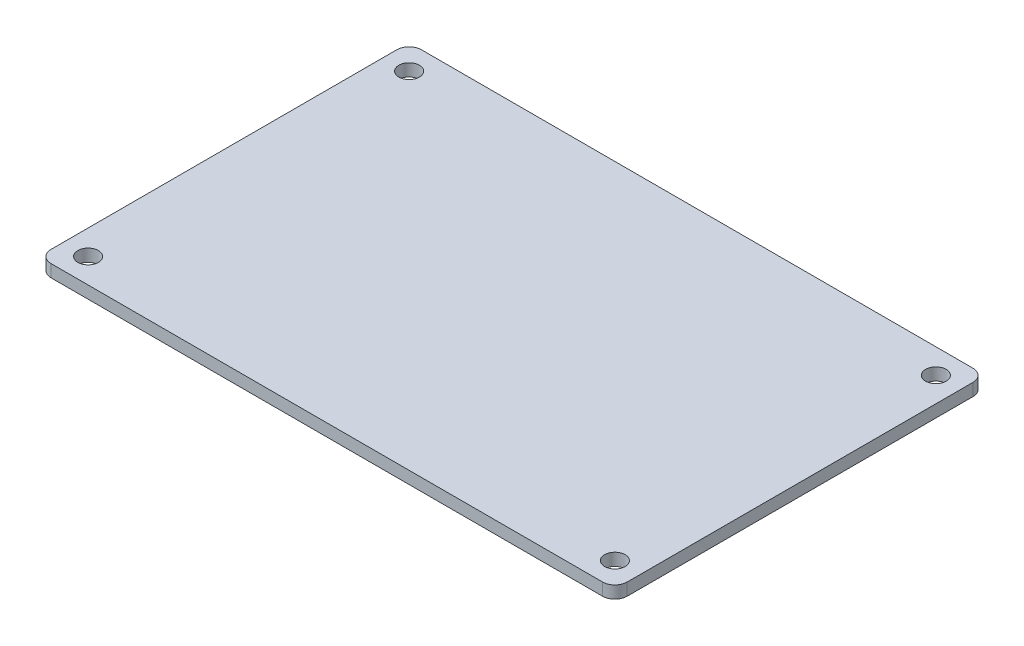
ISO-10303-21;
HEADER;
FILE_DESCRIPTION(('STEP AP214'),'2;1');
FILE_NAME('part.step','',(''),(''),'','','');
FILE_SCHEMA(('AUTOMOTIVE_DESIGN { 1 0 10303 214 1 1 1 1 }'));
ENDSEC;
DATA;
#1=APPLICATION_CONTEXT('core data for automotive mechanical design processes');
#2=APPLICATION_PROTOCOL_DEFINITION('international standard','automotive_design',2000,#1);
#3=PRODUCT_CONTEXT('',#1,'mechanical');
#4=PRODUCT('Part','Part','',(#3));
#5=PRODUCT_RELATED_PRODUCT_CATEGORY('part','',(#4));
#6=PRODUCT_DEFINITION_FORMATION('','',#4);
#7=PRODUCT_DEFINITION_CONTEXT('part definition',#1,'design');
#8=PRODUCT_DEFINITION('design','',#6,#7);
#9=PRODUCT_DEFINITION_SHAPE('','',#8);
#10=(LENGTH_UNIT() NAMED_UNIT(*) SI_UNIT(.MILLI.,.METRE.));
#11=(NAMED_UNIT(*) PLANE_ANGLE_UNIT() SI_UNIT($,.RADIAN.));
#12=(NAMED_UNIT(*) SI_UNIT($,.STERADIAN.) SOLID_ANGLE_UNIT());
#13=UNCERTAINTY_MEASURE_WITH_UNIT(LENGTH_MEASURE(1.E-05),#10,'distance_accuracy_value','');
#14=(GEOMETRIC_REPRESENTATION_CONTEXT(3) GLOBAL_UNCERTAINTY_ASSIGNED_CONTEXT((#13)) GLOBAL_UNIT_ASSIGNED_CONTEXT((#10,
#11,#12)) REPRESENTATION_CONTEXT('',''));
#15=CARTESIAN_POINT('',(0.,0.,0.));
#16=DIRECTION('',(0.,0.,1.));
#17=DIRECTION('',(1.,0.,0.));
#18=AXIS2_PLACEMENT_3D('',#15,#16,#17);
#19=CARTESIAN_POINT('',(-34.9250000289875,-9.,-23.7282204610565));
#20=DIRECTION('',(0.,1.,0.));
#21=DIRECTION('',(0.,0.,1.));
#22=AXIS2_PLACEMENT_3D('',#19,#20,#21);
#23=CYLINDRICAL_SURFACE('',#22,6.);
#24=CARTESIAN_POINT('',(-34.9250000289875,-3.,-23.7282204610565));
#25=DIRECTION('',(0.,-1.,0.));
#26=DIRECTION('',(0.,0.,-1.));
#27=AXIS2_PLACEMENT_3D('',#24,#25,#26);
#28=CIRCLE('',#27,6.);
#29=CARTESIAN_POINT('',(-34.9250000289875,-3.,-29.7282204610565));
#30=VERTEX_POINT('',#29);
#31=EDGE_CURVE('E167',#30,#30,#28,.F.);
#32=ORIENTED_EDGE('',*,*,#31,.F.);
#33=EDGE_LOOP('',(#32));
#34=FACE_BOUND('',#33,.T.);
#35=CARTESIAN_POINT('',(-34.9250000289875,-9.,-23.7282204610565));
#36=DIRECTION('',(0.,1.,0.));
#37=DIRECTION('',(0.,0.,1.));
#38=AXIS2_PLACEMENT_3D('',#35,#36,#37);
#39=CIRCLE('',#38,6.);
#40=CARTESIAN_POINT('',(-34.9250000289875,-9.,-17.7282204610565));
#41=VERTEX_POINT('',#40);
#42=EDGE_CURVE('E171',#41,#41,#39,.T.);
#43=ORIENTED_EDGE('',*,*,#42,.T.);
#44=EDGE_LOOP('',(#43));
#45=FACE_BOUND('',#44,.T.);
#46=ADVANCED_FACE('F34',(#34,#45),#23,.T.);
#47=CARTESIAN_POINT('',(-34.9250000289875,-9.,-23.7282204610565));
#48=DIRECTION('',(0.,1.,0.));
#49=DIRECTION('',(0.,0.,1.));
#50=AXIS2_PLACEMENT_3D('',#47,#48,#49);
#51=PLANE('',#50);
#52=CARTESIAN_POINT('',(-34.9250000289875,-9.,-23.7282204610565));
#53=DIRECTION('',(0.,1.,0.));
#54=DIRECTION('',(0.,0.,1.));
#55=AXIS2_PLACEMENT_3D('',#52,#53,#54);
#56=CIRCLE('',#55,3.);
#57=CARTESIAN_POINT('',(-34.9250000289875,-9.,-20.7282204610565));
#58=VERTEX_POINT('',#57);
#59=EDGE_CURVE('E172',#58,#58,#56,.T.);
#60=ORIENTED_EDGE('',*,*,#59,.T.);
#61=EDGE_LOOP('',(#60));
#62=FACE_BOUND('',#61,.T.);
#63=ORIENTED_EDGE('',*,*,#42,.F.);
#64=EDGE_LOOP('',(#63));
#65=FACE_BOUND('',#64,.T.);
#66=ADVANCED_FACE('F178',(#62,#65),#51,.F.);
#67=CARTESIAN_POINT('',(-34.9250000289875,-9.,-23.7282204610565));
#68=DIRECTION('',(0.,1.,0.));
#69=DIRECTION('',(0.,0.,1.));
#70=AXIS2_PLACEMENT_3D('',#67,#68,#69);
#71=CYLINDRICAL_SURFACE('',#70,3.);
#72=CARTESIAN_POINT('',(-34.9250000289875,-3.,-23.7282204610565));
#73=DIRECTION('',(0.,-1.,0.));
#74=DIRECTION('',(0.,0.,-1.));
#75=AXIS2_PLACEMENT_3D('',#72,#73,#74);
#76=CIRCLE('',#75,3.);
#77=CARTESIAN_POINT('',(-34.9250000289875,-3.,-26.7282204610565));
#78=VERTEX_POINT('',#77);
#79=EDGE_CURVE('E134',#78,#78,#76,.F.);
#80=ORIENTED_EDGE('',*,*,#79,.T.);
#81=EDGE_LOOP('',(#80));
#82=FACE_BOUND('',#81,.T.);
#83=ORIENTED_EDGE('',*,*,#59,.F.);
#84=EDGE_LOOP('',(#83));
#85=FACE_BOUND('',#84,.T.);
#86=ADVANCED_FACE('F180',(#82,#85),#71,.F.);
#87=CARTESIAN_POINT('',(0.,-3.,0.));
#88=DIRECTION('',(0.,-1.,0.));
#89=DIRECTION('',(0.,0.,-1.));
#90=AXIS2_PLACEMENT_3D('',#87,#88,#89);
#91=PLANE('',#90);
#92=ORIENTED_EDGE('',*,*,#79,.F.);
#93=EDGE_LOOP('',(#92));
#94=FACE_BOUND('',#93,.T.);
#95=ADVANCED_FACE('F187',(#94),#91,.T.);
#96=CARTESIAN_POINT('',(69.725915747739,-3.,-44.2183613735949));
#97=DIRECTION('',(1.,0.,0.));
#98=DIRECTION('',(0.,0.,-1.));
#99=AXIS2_PLACEMENT_3D('',#96,#97,#98);
#100=PLANE('',#99);
#101=DIRECTION('',(0.,0.,-1.));
#102=VECTOR('',#101,1.);
#103=CARTESIAN_POINT('',(69.725915747739,-3.,-44.2183613735949));
#104=LINE('',#103,#102);
#105=CARTESIAN_POINT('',(69.7259157477385,-3.,42.7816386264051));
#106=VERTEX_POINT('',#105);
#107=CARTESIAN_POINT('',(69.725915747739,-3.,-41.2183613735949));
#108=VERTEX_POINT('',#107);
#109=EDGE_CURVE('E163',#106,#108,#104,.T.);
#110=ORIENTED_EDGE('',*,*,#109,.T.);
#111=DIRECTION('',(0.,1.,0.));
#112=VECTOR('',#111,1.);
#113=CARTESIAN_POINT('',(69.725915747739,-3.,-41.2183613735949));
#114=LINE('',#113,#112);
#115=CARTESIAN_POINT('',(69.725915747739,0.,-41.2183613735949));
#116=VERTEX_POINT('',#115);
#117=EDGE_CURVE('E119',#108,#116,#114,.T.);
#118=ORIENTED_EDGE('',*,*,#117,.T.);
#119=DIRECTION('',(0.,0.,-1.));
#120=VECTOR('',#119,1.);
#121=CARTESIAN_POINT('',(69.725915747739,0.,-44.2183613735949));
#122=LINE('',#121,#120);
#123=CARTESIAN_POINT('',(69.7259157477384,0.,42.7816386264051));
#124=VERTEX_POINT('',#123);
#125=EDGE_CURVE('E102',#124,#116,#122,.T.);
#126=ORIENTED_EDGE('',*,*,#125,.F.);
#127=DIRECTION('',(0.,1.,0.));
#128=VECTOR('',#127,1.);
#129=CARTESIAN_POINT('',(69.7259157477385,-3.,42.7816386264051));
#130=LINE('',#129,#128);
#131=EDGE_CURVE('E116',#124,#106,#130,.F.);
#132=ORIENTED_EDGE('',*,*,#131,.T.);
#133=EDGE_LOOP('',(#110,#118,#126,#132));
#134=FACE_BOUND('',#133,.T.);
#135=ADVANCED_FACE('F115',(#134),#100,.T.);
#136=CARTESIAN_POINT('',(69.7259157477385,-3.,45.7816386264051));
#137=DIRECTION('',(0.,0.,1.));
#138=DIRECTION('',(1.,0.,0.));
#139=AXIS2_PLACEMENT_3D('',#136,#137,#138);
#140=PLANE('',#139);
#141=DIRECTION('',(1.,0.,0.));
#142=VECTOR('',#141,1.);
#143=CARTESIAN_POINT('',(69.7259157477385,-3.,45.7816386264051));
#144=LINE('',#143,#142);
#145=CARTESIAN_POINT('',(-67.2740842522615,-3.,45.7816386264051));
#146=VERTEX_POINT('',#145);
#147=CARTESIAN_POINT('',(66.7259157477385,-3.,45.7816386264051));
#148=VERTEX_POINT('',#147);
#149=EDGE_CURVE('E223',#146,#148,#144,.T.);
#150=ORIENTED_EDGE('',*,*,#149,.T.);
#151=DIRECTION('',(0.,1.,0.));
#152=VECTOR('',#151,1.);
#153=CARTESIAN_POINT('',(66.7259157477385,-3.,45.7816386264051));
#154=LINE('',#153,#152);
#155=CARTESIAN_POINT('',(66.7259157477385,0.,45.7816386264051));
#156=VERTEX_POINT('',#155);
#157=EDGE_CURVE('E153',#148,#156,#154,.T.);
#158=ORIENTED_EDGE('',*,*,#157,.T.);
#159=DIRECTION('',(1.,0.,0.));
#160=VECTOR('',#159,1.);
#161=CARTESIAN_POINT('',(69.7259157477385,0.,45.7816386264051));
#162=LINE('',#161,#160);
#163=CARTESIAN_POINT('',(-67.2740842522615,0.,45.7816386264051));
#164=VERTEX_POINT('',#163);
#165=EDGE_CURVE('E104',#164,#156,#162,.T.);
#166=ORIENTED_EDGE('',*,*,#165,.F.);
#167=DIRECTION('',(0.,1.,0.));
#168=VECTOR('',#167,1.);
#169=CARTESIAN_POINT('',(-67.2740842522615,-3.,45.7816386264051));
#170=LINE('',#169,#168);
#171=EDGE_CURVE('E151',#164,#146,#170,.F.);
#172=ORIENTED_EDGE('',*,*,#171,.T.);
#173=EDGE_LOOP('',(#150,#158,#166,#172));
#174=FACE_BOUND('',#173,.T.);
#175=ADVANCED_FACE('F240',(#174),#140,.T.);
#176=CARTESIAN_POINT('',(-70.2740842522615,-3.,-44.2183613735949));
#177=DIRECTION('',(-1.,0.,0.));
#178=DIRECTION('',(0.,0.,1.));
#179=AXIS2_PLACEMENT_3D('',#176,#177,#178);
#180=PLANE('',#179);
#181=DIRECTION('',(0.,0.,1.));
#182=VECTOR('',#181,1.);
#183=CARTESIAN_POINT('',(-70.2740842522615,0.,-44.2183613735949));
#184=LINE('',#183,#182);
#185=CARTESIAN_POINT('',(-70.2740842522616,0.,-41.2183613735949));
#186=VERTEX_POINT('',#185);
#187=CARTESIAN_POINT('',(-70.2740842522616,0.,42.7816386264051));
#188=VERTEX_POINT('',#187);
#189=EDGE_CURVE('E158',#186,#188,#184,.T.);
#190=ORIENTED_EDGE('',*,*,#189,.F.);
#191=DIRECTION('',(0.,1.,0.));
#192=VECTOR('',#191,1.);
#193=CARTESIAN_POINT('',(-70.2740842522616,-3.,-41.2183613735949));
#194=LINE('',#193,#192);
#195=CARTESIAN_POINT('',(-70.2740842522616,-3.,-41.2183613735949));
#196=VERTEX_POINT('',#195);
#197=EDGE_CURVE('E11',#186,#196,#194,.F.);
#198=ORIENTED_EDGE('',*,*,#197,.T.);
#199=DIRECTION('',(0.,0.,1.));
#200=VECTOR('',#199,1.);
#201=CARTESIAN_POINT('',(-70.2740842522615,-3.,-44.2183613735949));
#202=LINE('',#201,#200);
#203=CARTESIAN_POINT('',(-70.2740842522616,-3.,42.7816386264051));
#204=VERTEX_POINT('',#203);
#205=EDGE_CURVE('E159',#196,#204,#202,.T.);
#206=ORIENTED_EDGE('',*,*,#205,.T.);
#207=DIRECTION('',(0.,1.,0.));
#208=VECTOR('',#207,1.);
#209=CARTESIAN_POINT('',(-70.2740842522616,-3.,42.7816386264051));
#210=LINE('',#209,#208);
#211=EDGE_CURVE('E42',#204,#188,#210,.T.);
#212=ORIENTED_EDGE('',*,*,#211,.T.);
#213=EDGE_LOOP('',(#190,#198,#206,#212));
#214=FACE_BOUND('',#213,.T.);
#215=ADVANCED_FACE('F157',(#214),#180,.T.);
#216=CARTESIAN_POINT('',(69.725915747739,-3.,-44.2183613735949));
#217=DIRECTION('',(0.,0.,-1.));
#218=DIRECTION('',(-1.,0.,0.));
#219=AXIS2_PLACEMENT_3D('',#216,#217,#218);
#220=PLANE('',#219);
#221=DIRECTION('',(-1.,0.,0.));
#222=VECTOR('',#221,1.);
#223=CARTESIAN_POINT('',(69.725915747739,0.,-44.2183613735949));
#224=LINE('',#223,#222);
#225=CARTESIAN_POINT('',(66.725915747739,0.,-44.2183613735949));
#226=VERTEX_POINT('',#225);
#227=CARTESIAN_POINT('',(-67.2740842522615,0.,-44.2183613735949));
#228=VERTEX_POINT('',#227);
#229=EDGE_CURVE('E120',#226,#228,#224,.T.);
#230=ORIENTED_EDGE('',*,*,#229,.F.);
#231=DIRECTION('',(0.,1.,0.));
#232=VECTOR('',#231,1.);
#233=CARTESIAN_POINT('',(66.725915747739,-3.,-44.2183613735949));
#234=LINE('',#233,#232);
#235=CARTESIAN_POINT('',(66.725915747739,-3.,-44.2183613735949));
#236=VERTEX_POINT('',#235);
#237=EDGE_CURVE('E143',#226,#236,#234,.F.);
#238=ORIENTED_EDGE('',*,*,#237,.T.);
#239=DIRECTION('',(-1.,0.,0.));
#240=VECTOR('',#239,1.);
#241=CARTESIAN_POINT('',(69.725915747739,-3.,-44.2183613735949));
#242=LINE('',#241,#240);
#243=CARTESIAN_POINT('',(-67.2740842522615,-3.,-44.2183613735949));
#244=VERTEX_POINT('',#243);
#245=EDGE_CURVE('E216',#236,#244,#242,.T.);
#246=ORIENTED_EDGE('',*,*,#245,.T.);
#247=DIRECTION('',(0.,1.,0.));
#248=VECTOR('',#247,1.);
#249=CARTESIAN_POINT('',(-67.2740842522615,-3.,-44.2183613735949));
#250=LINE('',#249,#248);
#251=EDGE_CURVE('E140',#244,#228,#250,.T.);
#252=ORIENTED_EDGE('',*,*,#251,.T.);
#253=EDGE_LOOP('',(#230,#238,#246,#252));
#254=FACE_BOUND('',#253,.T.);
#255=ADVANCED_FACE('F220',(#254),#220,.T.);
#256=CARTESIAN_POINT('',(-41.2750000339225,-3.,24.5317795317435));
#257=DIRECTION('',(0.,-1.,0.));
#258=DIRECTION('',(0.,0.,-1.));
#259=AXIS2_PLACEMENT_3D('',#256,#257,#258);
#260=CIRCLE('',#259,6.00000000000001);
#261=CARTESIAN_POINT('',(-41.2750000339225,-3.,18.5317795317435));
#262=VERTEX_POINT('',#261);
#263=EDGE_CURVE('E126',#262,#262,#260,.T.);
#264=ORIENTED_EDGE('',*,*,#263,.F.);
#265=EDGE_LOOP('',(#264));
#266=FACE_BOUND('',#265,.T.);
#267=CARTESIAN_POINT('',(41.2750000339225,-3.,24.5317794796835));
#268=DIRECTION('',(0.,-1.,0.));
#269=DIRECTION('',(0.,0.,-1.));
#270=AXIS2_PLACEMENT_3D('',#267,#268,#269);
#271=CIRCLE('',#270,6.);
#272=CARTESIAN_POINT('',(41.2750000339225,-3.,18.5317794796835));
#273=VERTEX_POINT('',#272);
#274=EDGE_CURVE('E131',#273,#273,#271,.T.);
#275=ORIENTED_EDGE('',*,*,#274,.F.);
#276=EDGE_LOOP('',(#275));
#277=FACE_BOUND('',#276,.T.);
#278=CARTESIAN_POINT('',(40.0049999842425,-3.,-23.7282204529105));
#279=DIRECTION('',(0.,-1.,0.));
#280=DIRECTION('',(0.,0.,-1.));
#281=AXIS2_PLACEMENT_3D('',#278,#279,#280);
#282=CIRCLE('',#281,6.00000000000001);
#283=CARTESIAN_POINT('',(40.0049999842425,-3.,-29.7282204529105));
#284=VERTEX_POINT('',#283);
#285=EDGE_CURVE('E170',#284,#284,#282,.T.);
#286=ORIENTED_EDGE('',*,*,#285,.F.);
#287=EDGE_LOOP('',(#286));
#288=FACE_BOUND('',#287,.T.);
#289=ORIENTED_EDGE('',*,*,#31,.T.);
#290=EDGE_LOOP('',(#289));
#291=FACE_BOUND('',#290,.T.);
#292=CARTESIAN_POINT('',(-64.2740842522615,-3.,39.7816386264051));
#293=DIRECTION('',(0.,1.,0.));
#294=DIRECTION('',(0.,0.,-1.));
#295=AXIS2_PLACEMENT_3D('',#292,#293,#294);
#296=CIRCLE('',#295,2.49999999999141);
#297=CARTESIAN_POINT('',(-64.2740842522615,-3.,37.2816386264137));
#298=VERTEX_POINT('',#297);
#299=EDGE_CURVE('E315',#298,#298,#296,.T.);
#300=ORIENTED_EDGE('',*,*,#299,.T.);
#301=EDGE_LOOP('',(#300));
#302=FACE_BOUND('',#301,.T.);
#303=CARTESIAN_POINT('',(63.7259157477384,-3.,39.7816386264051));
#304=DIRECTION('',(0.,1.,0.));
#305=DIRECTION('',(0.,0.,1.));
#306=AXIS2_PLACEMENT_3D('',#303,#304,#305);
#307=CIRCLE('',#306,2.49999999999142);
#308=CARTESIAN_POINT('',(63.7259157477384,-3.,42.2816386263965));
#309=VERTEX_POINT('',#308);
#310=EDGE_CURVE('E321',#309,#309,#307,.T.);
#311=ORIENTED_EDGE('',*,*,#310,.T.);
#312=EDGE_LOOP('',(#311));
#313=FACE_BOUND('',#312,.T.);
#314=CARTESIAN_POINT('',(63.7259157477385,-3.,-38.2183613735949));
#315=DIRECTION('',(0.,1.,0.));
#316=DIRECTION('',(0.,0.,-1.));
#317=AXIS2_PLACEMENT_3D('',#314,#315,#316);
#318=CIRCLE('',#317,2.50000000000535);
#319=CARTESIAN_POINT('',(63.7259157477385,-3.,-40.7183613736002));
#320=VERTEX_POINT('',#319);
#321=EDGE_CURVE('E327',#320,#320,#318,.T.);
#322=ORIENTED_EDGE('',*,*,#321,.T.);
#323=EDGE_LOOP('',(#322));
#324=FACE_BOUND('',#323,.T.);
#325=CARTESIAN_POINT('',(-64.2740842522615,-3.,-38.2183613735949));
#326=DIRECTION('',(0.,1.,0.));
#327=DIRECTION('',(0.,0.,1.));
#328=AXIS2_PLACEMENT_3D('',#325,#326,#327);
#329=CIRCLE('',#328,2.49999999997806);
#330=CARTESIAN_POINT('',(-64.2740842522615,-3.,-35.7183613736168));
#331=VERTEX_POINT('',#330);
#332=EDGE_CURVE('E121',#331,#331,#329,.T.);
#333=ORIENTED_EDGE('',*,*,#332,.T.);
#334=EDGE_LOOP('',(#333));
#335=FACE_BOUND('',#334,.T.);
#336=ORIENTED_EDGE('',*,*,#245,.F.);
#337=CARTESIAN_POINT('',(66.725915747739,-3.,-41.2183613735949));
#338=DIRECTION('',(0.,-1.,0.));
#339=DIRECTION('',(0.,0.,-1.));
#340=AXIS2_PLACEMENT_3D('',#337,#338,#339);
#341=CIRCLE('',#340,3.);
#342=EDGE_CURVE('E149',#236,#108,#341,.T.);
#343=ORIENTED_EDGE('',*,*,#342,.T.);
#344=ORIENTED_EDGE('',*,*,#109,.F.);
#345=CARTESIAN_POINT('',(66.7259157477385,-3.,42.7816386264051));
#346=DIRECTION('',(0.,-1.,0.));
#347=DIRECTION('',(0.,0.,-1.));
#348=AXIS2_PLACEMENT_3D('',#345,#346,#347);
#349=CIRCLE('',#348,3.);
#350=EDGE_CURVE('E125',#106,#148,#349,.T.);
#351=ORIENTED_EDGE('',*,*,#350,.T.);
#352=ORIENTED_EDGE('',*,*,#149,.F.);
#353=CARTESIAN_POINT('',(-67.2740842522616,-3.,42.7816386264051));
#354=DIRECTION('',(0.,-1.,0.));
#355=DIRECTION('',(0.,0.,-1.));
#356=AXIS2_PLACEMENT_3D('',#353,#354,#355);
#357=CIRCLE('',#356,3.);
#358=EDGE_CURVE('E49',#146,#204,#357,.T.);
#359=ORIENTED_EDGE('',*,*,#358,.T.);
#360=ORIENTED_EDGE('',*,*,#205,.F.);
#361=CARTESIAN_POINT('',(-67.2740842522616,-3.,-41.2183613735949));
#362=DIRECTION('',(0.,-1.,0.));
#363=DIRECTION('',(0.,0.,-1.));
#364=AXIS2_PLACEMENT_3D('',#361,#362,#363);
#365=CIRCLE('',#364,3.);
#366=EDGE_CURVE('E146',#196,#244,#365,.T.);
#367=ORIENTED_EDGE('',*,*,#366,.T.);
#368=EDGE_LOOP('',(#336,#343,#344,#351,#352,#359,#360,#367));
#369=FACE_BOUND('',#368,.T.);
#370=ADVANCED_FACE('F215',(#266,#277,#288,#291,#302,#313,#324,#335,#369),#91,.T.);
#371=CARTESIAN_POINT('',(-64.2740842522615,-3.,-38.2183613735949));
#372=DIRECTION('',(0.,1.,0.));
#373=DIRECTION('',(0.,0.,1.));
#374=AXIS2_PLACEMENT_3D('',#371,#372,#373);
#375=CYLINDRICAL_SURFACE('',#374,2.49999999997806);
#376=ORIENTED_EDGE('',*,*,#332,.F.);
#377=EDGE_LOOP('',(#376));
#378=FACE_BOUND('',#377,.T.);
#379=CARTESIAN_POINT('',(-64.2740842522615,0.,-38.2183613735949));
#380=DIRECTION('',(0.,1.,0.));
#381=DIRECTION('',(0.,0.,1.));
#382=AXIS2_PLACEMENT_3D('',#379,#380,#381);
#383=CIRCLE('',#382,2.49999999997806);
#384=CARTESIAN_POINT('',(-64.2740842522615,0.,-35.7183613736168));
#385=VERTEX_POINT('',#384);
#386=EDGE_CURVE('E330',#385,#385,#383,.T.);
#387=ORIENTED_EDGE('',*,*,#386,.T.);
#388=EDGE_LOOP('',(#387));
#389=FACE_BOUND('',#388,.T.);
#390=ADVANCED_FACE('F244',(#378,#389),#375,.F.);
#391=CARTESIAN_POINT('',(63.7259157477385,-3.,-38.2183613735949));
#392=DIRECTION('',(0.,1.,0.));
#393=DIRECTION('',(0.,0.,1.));
#394=AXIS2_PLACEMENT_3D('',#391,#392,#393);
#395=CYLINDRICAL_SURFACE('',#394,2.50000000000535);
#396=ORIENTED_EDGE('',*,*,#321,.F.);
#397=EDGE_LOOP('',(#396));
#398=FACE_BOUND('',#397,.T.);
#399=CARTESIAN_POINT('',(63.7259157477384,0.,-38.2183613735949));
#400=DIRECTION('',(0.,1.,0.));
#401=DIRECTION('',(0.,0.,-1.));
#402=AXIS2_PLACEMENT_3D('',#399,#400,#401);
#403=CIRCLE('',#402,2.50000000000535);
#404=CARTESIAN_POINT('',(63.7259157477384,0.,-40.7183613736002));
#405=VERTEX_POINT('',#404);
#406=EDGE_CURVE('E324',#405,#405,#403,.T.);
#407=ORIENTED_EDGE('',*,*,#406,.T.);
#408=EDGE_LOOP('',(#407));
#409=FACE_BOUND('',#408,.T.);
#410=ADVANCED_FACE('F339',(#398,#409),#395,.F.);
#411=CARTESIAN_POINT('',(63.7259157477384,-3.,39.7816386264051));
#412=DIRECTION('',(0.,1.,0.));
#413=DIRECTION('',(0.,0.,1.));
#414=AXIS2_PLACEMENT_3D('',#411,#412,#413);
#415=CYLINDRICAL_SURFACE('',#414,2.49999999999142);
#416=ORIENTED_EDGE('',*,*,#310,.F.);
#417=EDGE_LOOP('',(#416));
#418=FACE_BOUND('',#417,.T.);
#419=CARTESIAN_POINT('',(63.7259157477384,0.,39.7816386264051));
#420=DIRECTION('',(0.,1.,0.));
#421=DIRECTION('',(0.,0.,1.));
#422=AXIS2_PLACEMENT_3D('',#419,#420,#421);
#423=CIRCLE('',#422,2.49999999999142);
#424=CARTESIAN_POINT('',(63.7259157477384,0.,42.2816386263965));
#425=VERTEX_POINT('',#424);
#426=EDGE_CURVE('E318',#425,#425,#423,.T.);
#427=ORIENTED_EDGE('',*,*,#426,.T.);
#428=EDGE_LOOP('',(#427));
#429=FACE_BOUND('',#428,.T.);
#430=ADVANCED_FACE('F344',(#418,#429),#415,.F.);
#431=CARTESIAN_POINT('',(-64.2740842522615,-3.,39.7816386264051));
#432=DIRECTION('',(0.,1.,0.));
#433=DIRECTION('',(0.,0.,1.));
#434=AXIS2_PLACEMENT_3D('',#431,#432,#433);
#435=CYLINDRICAL_SURFACE('',#434,2.49999999999141);
#436=ORIENTED_EDGE('',*,*,#299,.F.);
#437=EDGE_LOOP('',(#436));
#438=FACE_BOUND('',#437,.T.);
#439=CARTESIAN_POINT('',(-64.2740842522615,0.,39.7816386264051));
#440=DIRECTION('',(0.,1.,0.));
#441=DIRECTION('',(0.,0.,-1.));
#442=AXIS2_PLACEMENT_3D('',#439,#440,#441);
#443=CIRCLE('',#442,2.49999999999141);
#444=CARTESIAN_POINT('',(-64.2740842522615,0.,37.2816386264137));
#445=VERTEX_POINT('',#444);
#446=EDGE_CURVE('E312',#445,#445,#443,.T.);
#447=ORIENTED_EDGE('',*,*,#446,.T.);
#448=EDGE_LOOP('',(#447));
#449=FACE_BOUND('',#448,.T.);
#450=ADVANCED_FACE('F196',(#438,#449),#435,.F.);
#451=CARTESIAN_POINT('',(-34.9250000289875,0.,-23.7282204610565));
#452=DIRECTION('',(0.,1.,0.));
#453=DIRECTION('',(0.,0.,1.));
#454=AXIS2_PLACEMENT_3D('',#451,#452,#453);
#455=PLANE('',#454);
#456=ORIENTED_EDGE('',*,*,#446,.F.);
#457=EDGE_LOOP('',(#456));
#458=FACE_BOUND('',#457,.T.);
#459=ORIENTED_EDGE('',*,*,#426,.F.);
#460=EDGE_LOOP('',(#459));
#461=FACE_BOUND('',#460,.T.);
#462=ORIENTED_EDGE('',*,*,#406,.F.);
#463=EDGE_LOOP('',(#462));
#464=FACE_BOUND('',#463,.T.);
#465=ORIENTED_EDGE('',*,*,#386,.F.);
#466=EDGE_LOOP('',(#465));
#467=FACE_BOUND('',#466,.T.);
#468=ORIENTED_EDGE('',*,*,#125,.T.);
#469=CARTESIAN_POINT('',(66.725915747739,0.,-41.2183613735949));
#470=DIRECTION('',(0.,1.,0.));
#471=DIRECTION('',(0.,0.,1.));
#472=AXIS2_PLACEMENT_3D('',#469,#470,#471);
#473=CIRCLE('',#472,3.);
#474=EDGE_CURVE('E109',#116,#226,#473,.T.);
#475=ORIENTED_EDGE('',*,*,#474,.T.);
#476=ORIENTED_EDGE('',*,*,#229,.T.);
#477=CARTESIAN_POINT('',(-67.2740842522616,0.,-41.2183613735949));
#478=DIRECTION('',(0.,1.,0.));
#479=DIRECTION('',(0.,0.,1.));
#480=AXIS2_PLACEMENT_3D('',#477,#478,#479);
#481=CIRCLE('',#480,3.);
#482=EDGE_CURVE('E110',#228,#186,#481,.T.);
#483=ORIENTED_EDGE('',*,*,#482,.T.);
#484=ORIENTED_EDGE('',*,*,#189,.T.);
#485=CARTESIAN_POINT('',(-67.2740842522616,0.,42.7816386264051));
#486=DIRECTION('',(0.,1.,0.));
#487=DIRECTION('',(0.,0.,1.));
#488=AXIS2_PLACEMENT_3D('',#485,#486,#487);
#489=CIRCLE('',#488,3.);
#490=EDGE_CURVE('E128',#188,#164,#489,.T.);
#491=ORIENTED_EDGE('',*,*,#490,.T.);
#492=ORIENTED_EDGE('',*,*,#165,.T.);
#493=CARTESIAN_POINT('',(66.7259157477384,0.,42.7816386264051));
#494=DIRECTION('',(0.,1.,0.));
#495=DIRECTION('',(0.,0.,1.));
#496=AXIS2_PLACEMENT_3D('',#493,#494,#495);
#497=CIRCLE('',#496,3.);
#498=EDGE_CURVE('E99',#156,#124,#497,.T.);
#499=ORIENTED_EDGE('',*,*,#498,.T.);
#500=EDGE_LOOP('',(#468,#475,#476,#483,#484,#491,#492,#499));
#501=FACE_BOUND('',#500,.T.);
#502=ADVANCED_FACE('F101',(#458,#461,#464,#467,#501),#455,.T.);
#503=CARTESIAN_POINT('',(40.0049999842425,-9.,-23.7282204529105));
#504=DIRECTION('',(0.,1.,0.));
#505=DIRECTION('',(0.,0.,1.));
#506=AXIS2_PLACEMENT_3D('',#503,#504,#505);
#507=CYLINDRICAL_SURFACE('',#506,6.00000000000001);
#508=ORIENTED_EDGE('',*,*,#285,.T.);
#509=EDGE_LOOP('',(#508));
#510=FACE_BOUND('',#509,.T.);
#511=CARTESIAN_POINT('',(40.0049999842425,-9.,-23.7282204529105));
#512=DIRECTION('',(0.,1.,0.));
#513=DIRECTION('',(0.,0.,1.));
#514=AXIS2_PLACEMENT_3D('',#511,#512,#513);
#515=CIRCLE('',#514,6.00000000000001);
#516=CARTESIAN_POINT('',(40.0049999842425,-9.,-17.7282204529105));
#517=VERTEX_POINT('',#516);
#518=EDGE_CURVE('E307',#517,#517,#515,.T.);
#519=ORIENTED_EDGE('',*,*,#518,.T.);
#520=EDGE_LOOP('',(#519));
#521=FACE_BOUND('',#520,.T.);
#522=ADVANCED_FACE('F195',(#510,#521),#507,.T.);
#523=CARTESIAN_POINT('',(40.0049999842425,-9.,-23.7282204529105));
#524=DIRECTION('',(0.,1.,0.));
#525=DIRECTION('',(0.,0.,1.));
#526=AXIS2_PLACEMENT_3D('',#523,#524,#525);
#527=PLANE('',#526);
#528=CARTESIAN_POINT('',(40.0049999842425,-9.,-23.7282204529105));
#529=DIRECTION('',(0.,1.,0.));
#530=DIRECTION('',(0.,0.,1.));
#531=AXIS2_PLACEMENT_3D('',#528,#529,#530);
#532=CIRCLE('',#531,3.);
#533=CARTESIAN_POINT('',(40.0049999842425,-9.,-20.7282204529105));
#534=VERTEX_POINT('',#533);
#535=EDGE_CURVE('E302',#534,#534,#532,.T.);
#536=ORIENTED_EDGE('',*,*,#535,.T.);
#537=EDGE_LOOP('',(#536));
#538=FACE_BOUND('',#537,.T.);
#539=ORIENTED_EDGE('',*,*,#518,.F.);
#540=EDGE_LOOP('',(#539));
#541=FACE_BOUND('',#540,.T.);
#542=ADVANCED_FACE('F258',(#538,#541),#527,.F.);
#543=CARTESIAN_POINT('',(40.0049999842425,-9.,-23.7282204529105));
#544=DIRECTION('',(0.,1.,0.));
#545=DIRECTION('',(0.,0.,1.));
#546=AXIS2_PLACEMENT_3D('',#543,#544,#545);
#547=CYLINDRICAL_SURFACE('',#546,3.);
#548=CARTESIAN_POINT('',(40.0049999842425,-3.,-23.7282204529105));
#549=DIRECTION('',(0.,-1.,0.));
#550=DIRECTION('',(0.,0.,-1.));
#551=AXIS2_PLACEMENT_3D('',#548,#549,#550);
#552=CIRCLE('',#551,3.);
#553=CARTESIAN_POINT('',(40.0049999842425,-3.,-26.7282204529105));
#554=VERTEX_POINT('',#553);
#555=EDGE_CURVE('E310',#554,#554,#552,.T.);
#556=ORIENTED_EDGE('',*,*,#555,.F.);
#557=EDGE_LOOP('',(#556));
#558=FACE_BOUND('',#557,.T.);
#559=ORIENTED_EDGE('',*,*,#535,.F.);
#560=EDGE_LOOP('',(#559));
#561=FACE_BOUND('',#560,.T.);
#562=ADVANCED_FACE('F248',(#558,#561),#547,.F.);
#563=ORIENTED_EDGE('',*,*,#555,.T.);
#564=EDGE_LOOP('',(#563));
#565=FACE_BOUND('',#564,.T.);
#566=ADVANCED_FACE('F236',(#565),#91,.T.);
#567=CARTESIAN_POINT('',(41.2750000339225,-9.,24.5317794796835));
#568=DIRECTION('',(0.,1.,0.));
#569=DIRECTION('',(0.,0.,1.));
#570=AXIS2_PLACEMENT_3D('',#567,#568,#569);
#571=CYLINDRICAL_SURFACE('',#570,6.);
#572=ORIENTED_EDGE('',*,*,#274,.T.);
#573=EDGE_LOOP('',(#572));
#574=FACE_BOUND('',#573,.T.);
#575=CARTESIAN_POINT('',(41.2750000339225,-9.,24.5317794796835));
#576=DIRECTION('',(0.,1.,0.));
#577=DIRECTION('',(0.,0.,1.));
#578=AXIS2_PLACEMENT_3D('',#575,#576,#577);
#579=CIRCLE('',#578,6.);
#580=CARTESIAN_POINT('',(41.2750000339225,-9.,30.5317794796835));
#581=VERTEX_POINT('',#580);
#582=EDGE_CURVE('E291',#581,#581,#579,.T.);
#583=ORIENTED_EDGE('',*,*,#582,.T.);
#584=EDGE_LOOP('',(#583));
#585=FACE_BOUND('',#584,.T.);
#586=ADVANCED_FACE('F247',(#574,#585),#571,.T.);
#587=CARTESIAN_POINT('',(41.2750000339225,-9.,24.5317794796835));
#588=DIRECTION('',(0.,1.,0.));
#589=DIRECTION('',(0.,0.,1.));
#590=AXIS2_PLACEMENT_3D('',#587,#588,#589);
#591=PLANE('',#590);
#592=CARTESIAN_POINT('',(41.2750000339225,-9.,24.5317794796835));
#593=DIRECTION('',(0.,1.,0.));
#594=DIRECTION('',(0.,0.,1.));
#595=AXIS2_PLACEMENT_3D('',#592,#593,#594);
#596=CIRCLE('',#595,3.);
#597=CARTESIAN_POINT('',(41.2750000339225,-9.,27.5317794796835));
#598=VERTEX_POINT('',#597);
#599=EDGE_CURVE('E287',#598,#598,#596,.T.);
#600=ORIENTED_EDGE('',*,*,#599,.T.);
#601=EDGE_LOOP('',(#600));
#602=FACE_BOUND('',#601,.T.);
#603=ORIENTED_EDGE('',*,*,#582,.F.);
#604=EDGE_LOOP('',(#603));
#605=FACE_BOUND('',#604,.T.);
#606=ADVANCED_FACE('F255',(#602,#605),#591,.F.);
#607=CARTESIAN_POINT('',(41.2750000339225,-9.,24.5317794796835));
#608=DIRECTION('',(0.,1.,0.));
#609=DIRECTION('',(0.,0.,1.));
#610=AXIS2_PLACEMENT_3D('',#607,#608,#609);
#611=CYLINDRICAL_SURFACE('',#610,3.);
#612=CARTESIAN_POINT('',(41.2750000339225,-3.,24.5317794796835));
#613=DIRECTION('',(0.,-1.,0.));
#614=DIRECTION('',(0.,0.,-1.));
#615=AXIS2_PLACEMENT_3D('',#612,#613,#614);
#616=CIRCLE('',#615,3.);
#617=CARTESIAN_POINT('',(41.2750000339225,-3.,21.5317794796835));
#618=VERTEX_POINT('',#617);
#619=EDGE_CURVE('E300',#618,#618,#616,.T.);
#620=ORIENTED_EDGE('',*,*,#619,.F.);
#621=EDGE_LOOP('',(#620));
#622=FACE_BOUND('',#621,.T.);
#623=ORIENTED_EDGE('',*,*,#599,.F.);
#624=EDGE_LOOP('',(#623));
#625=FACE_BOUND('',#624,.T.);
#626=ADVANCED_FACE('F264',(#622,#625),#611,.F.);
#627=ORIENTED_EDGE('',*,*,#619,.T.);
#628=EDGE_LOOP('',(#627));
#629=FACE_BOUND('',#628,.T.);
#630=ADVANCED_FACE('F250',(#629),#91,.T.);
#631=CARTESIAN_POINT('',(-41.2750000339225,-9.,24.5317795317435));
#632=DIRECTION('',(0.,1.,0.));
#633=DIRECTION('',(0.,0.,1.));
#634=AXIS2_PLACEMENT_3D('',#631,#632,#633);
#635=CYLINDRICAL_SURFACE('',#634,6.00000000000001);
#636=ORIENTED_EDGE('',*,*,#263,.T.);
#637=EDGE_LOOP('',(#636));
#638=FACE_BOUND('',#637,.T.);
#639=CARTESIAN_POINT('',(-41.2750000339225,-9.,24.5317795317435));
#640=DIRECTION('',(0.,1.,0.));
#641=DIRECTION('',(0.,0.,1.));
#642=AXIS2_PLACEMENT_3D('',#639,#640,#641);
#643=CIRCLE('',#642,6.00000000000001);
#644=CARTESIAN_POINT('',(-41.2750000339225,-9.,30.5317795317435));
#645=VERTEX_POINT('',#644);
#646=EDGE_CURVE('E288',#645,#645,#643,.T.);
#647=ORIENTED_EDGE('',*,*,#646,.T.);
#648=EDGE_LOOP('',(#647));
#649=FACE_BOUND('',#648,.T.);
#650=ADVANCED_FACE('F263',(#638,#649),#635,.T.);
#651=CARTESIAN_POINT('',(-41.2750000339225,-9.,24.5317795317435));
#652=DIRECTION('',(0.,1.,0.));
#653=DIRECTION('',(0.,0.,1.));
#654=AXIS2_PLACEMENT_3D('',#651,#652,#653);
#655=PLANE('',#654);
#656=CARTESIAN_POINT('',(-41.2750000339225,-9.,24.5317795317435));
#657=DIRECTION('',(0.,1.,0.));
#658=DIRECTION('',(0.,0.,1.));
#659=AXIS2_PLACEMENT_3D('',#656,#657,#658);
#660=CIRCLE('',#659,3.);
#661=CARTESIAN_POINT('',(-41.2750000339225,-9.,27.5317795317435));
#662=VERTEX_POINT('',#661);
#663=EDGE_CURVE('E294',#662,#662,#660,.T.);
#664=ORIENTED_EDGE('',*,*,#663,.T.);
#665=EDGE_LOOP('',(#664));
#666=FACE_BOUND('',#665,.T.);
#667=ORIENTED_EDGE('',*,*,#646,.F.);
#668=EDGE_LOOP('',(#667));
#669=FACE_BOUND('',#668,.T.);
#670=ADVANCED_FACE('F270',(#666,#669),#655,.F.);
#671=CARTESIAN_POINT('',(-41.2750000339225,-9.,24.5317795317435));
#672=DIRECTION('',(0.,1.,0.));
#673=DIRECTION('',(0.,0.,1.));
#674=AXIS2_PLACEMENT_3D('',#671,#672,#673);
#675=CYLINDRICAL_SURFACE('',#674,3.);
#676=CARTESIAN_POINT('',(-41.2750000339225,-3.,24.5317795317435));
#677=DIRECTION('',(0.,-1.,0.));
#678=DIRECTION('',(0.,0.,-1.));
#679=AXIS2_PLACEMENT_3D('',#676,#677,#678);
#680=CIRCLE('',#679,3.);
#681=CARTESIAN_POINT('',(-41.2750000339225,-3.,21.5317795317435));
#682=VERTEX_POINT('',#681);
#683=EDGE_CURVE('E286',#682,#682,#680,.T.);
#684=ORIENTED_EDGE('',*,*,#683,.F.);
#685=EDGE_LOOP('',(#684));
#686=FACE_BOUND('',#685,.T.);
#687=ORIENTED_EDGE('',*,*,#663,.F.);
#688=EDGE_LOOP('',(#687));
#689=FACE_BOUND('',#688,.T.);
#690=ADVANCED_FACE('F277',(#686,#689),#675,.F.);
#691=ORIENTED_EDGE('',*,*,#683,.T.);
#692=EDGE_LOOP('',(#691));
#693=FACE_BOUND('',#692,.T.);
#694=ADVANCED_FACE('F202',(#693),#91,.T.);
#695=CARTESIAN_POINT('',(66.725915747739,-3.,-41.2183613735949));
#696=DIRECTION('',(0.,1.,0.));
#697=DIRECTION('',(0.,0.,1.));
#698=AXIS2_PLACEMENT_3D('',#695,#696,#697);
#699=CYLINDRICAL_SURFACE('',#698,3.);
#700=ORIENTED_EDGE('',*,*,#342,.F.);
#701=ORIENTED_EDGE('',*,*,#237,.F.);
#702=ORIENTED_EDGE('',*,*,#474,.F.);
#703=ORIENTED_EDGE('',*,*,#117,.F.);
#704=EDGE_LOOP('',(#700,#701,#702,#703));
#705=FACE_BOUND('',#704,.T.);
#706=ADVANCED_FACE('F199',(#705),#699,.T.);
#707=CARTESIAN_POINT('',(66.7259157477385,-3.,42.7816386264051));
#708=DIRECTION('',(0.,1.,0.));
#709=DIRECTION('',(0.,0.,1.));
#710=AXIS2_PLACEMENT_3D('',#707,#708,#709);
#711=CYLINDRICAL_SURFACE('',#710,3.);
#712=ORIENTED_EDGE('',*,*,#350,.F.);
#713=ORIENTED_EDGE('',*,*,#131,.F.);
#714=ORIENTED_EDGE('',*,*,#498,.F.);
#715=ORIENTED_EDGE('',*,*,#157,.F.);
#716=EDGE_LOOP('',(#712,#713,#714,#715));
#717=FACE_BOUND('',#716,.T.);
#718=ADVANCED_FACE('F124',(#717),#711,.T.);
#719=CARTESIAN_POINT('',(-67.2740842522616,-3.,-41.2183613735949));
#720=DIRECTION('',(0.,1.,0.));
#721=DIRECTION('',(0.,0.,1.));
#722=AXIS2_PLACEMENT_3D('',#719,#720,#721);
#723=CYLINDRICAL_SURFACE('',#722,3.);
#724=ORIENTED_EDGE('',*,*,#366,.F.);
#725=ORIENTED_EDGE('',*,*,#197,.F.);
#726=ORIENTED_EDGE('',*,*,#482,.F.);
#727=ORIENTED_EDGE('',*,*,#251,.F.);
#728=EDGE_LOOP('',(#724,#725,#726,#727));
#729=FACE_BOUND('',#728,.T.);
#730=ADVANCED_FACE('F205',(#729),#723,.T.);
#731=CARTESIAN_POINT('',(-67.2740842522616,-3.,42.7816386264051));
#732=DIRECTION('',(0.,1.,0.));
#733=DIRECTION('',(0.,0.,1.));
#734=AXIS2_PLACEMENT_3D('',#731,#732,#733);
#735=CYLINDRICAL_SURFACE('',#734,3.);
#736=ORIENTED_EDGE('',*,*,#358,.F.);
#737=ORIENTED_EDGE('',*,*,#171,.F.);
#738=ORIENTED_EDGE('',*,*,#490,.F.);
#739=ORIENTED_EDGE('',*,*,#211,.F.);
#740=EDGE_LOOP('',(#736,#737,#738,#739));
#741=FACE_BOUND('',#740,.T.);
#742=ADVANCED_FACE('F36',(#741),#735,.T.);
#743=CLOSED_SHELL('',(#46,#66,#86,#95,#135,#175,#215,#255,#370,#390,#410,#430,#450,#502,#522,
#542,#562,#566,#586,#606,#626,#630,#650,#670,#690,#694,#706,#718,#730,#742));
#744=MANIFOLD_SOLID_BREP('B2',#743);
#745=ADVANCED_BREP_SHAPE_REPRESENTATION('',(#18,#744),#14);
#746=SHAPE_DEFINITION_REPRESENTATION(#9,#745);
ENDSEC;
END-ISO-10303-21;
